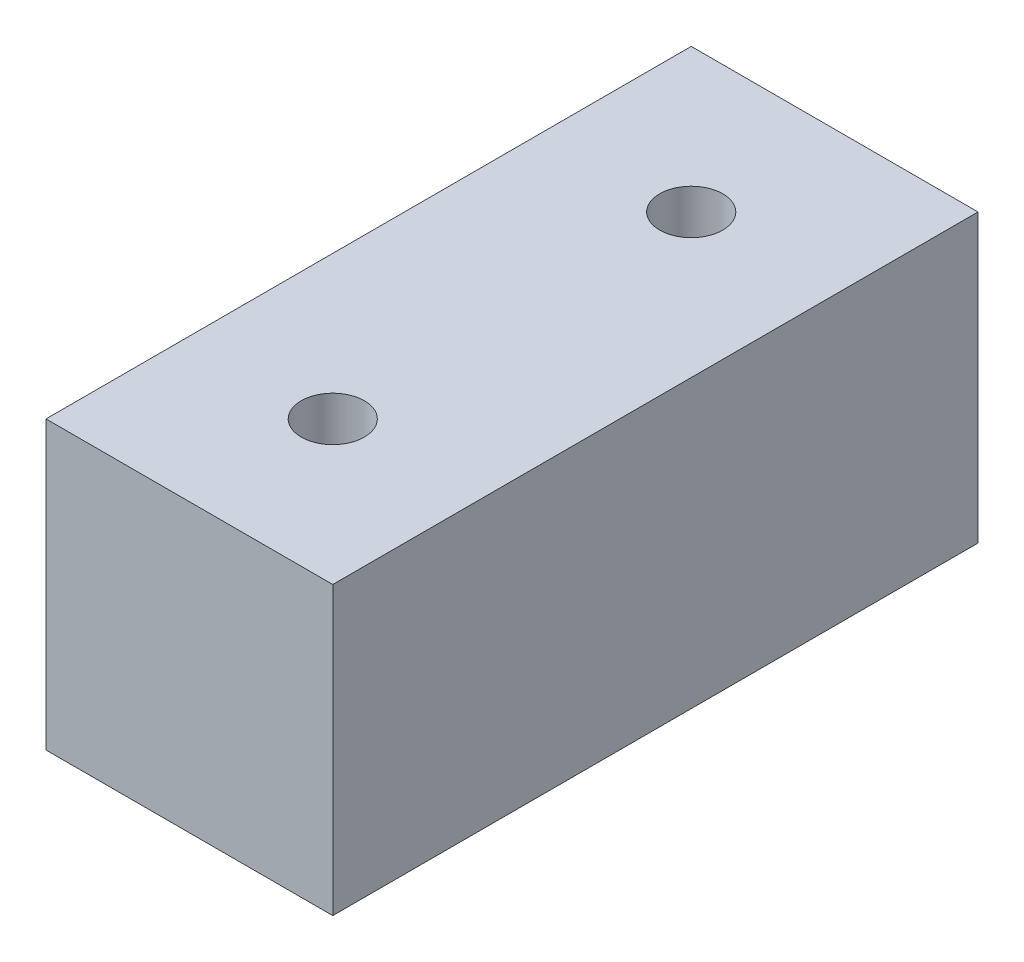
ISO-10303-21;
HEADER;
FILE_DESCRIPTION(('STEP AP214'),'2;1');
FILE_NAME('part.step','',(''),(''),'','','');
FILE_SCHEMA(('AUTOMOTIVE_DESIGN { 1 0 10303 214 1 1 1 1 }'));
ENDSEC;
DATA;
#1=APPLICATION_CONTEXT('core data for automotive mechanical design processes');
#2=APPLICATION_PROTOCOL_DEFINITION('international standard','automotive_design',2000,#1);
#3=PRODUCT_CONTEXT('',#1,'mechanical');
#4=PRODUCT('Part','Part','',(#3));
#5=PRODUCT_RELATED_PRODUCT_CATEGORY('part','',(#4));
#6=PRODUCT_DEFINITION_FORMATION('','',#4);
#7=PRODUCT_DEFINITION_CONTEXT('part definition',#1,'design');
#8=PRODUCT_DEFINITION('design','',#6,#7);
#9=PRODUCT_DEFINITION_SHAPE('','',#8);
#10=(LENGTH_UNIT() NAMED_UNIT(*) SI_UNIT(.MILLI.,.METRE.));
#11=(NAMED_UNIT(*) PLANE_ANGLE_UNIT() SI_UNIT($,.RADIAN.));
#12=(NAMED_UNIT(*) SI_UNIT($,.STERADIAN.) SOLID_ANGLE_UNIT());
#13=UNCERTAINTY_MEASURE_WITH_UNIT(LENGTH_MEASURE(1.E-05),#10,'distance_accuracy_value','');
#14=(GEOMETRIC_REPRESENTATION_CONTEXT(3) GLOBAL_UNCERTAINTY_ASSIGNED_CONTEXT((#13)) GLOBAL_UNIT_ASSIGNED_CONTEXT((#10,
#11,#12)) REPRESENTATION_CONTEXT('',''));
#15=CARTESIAN_POINT('',(0.,0.,0.));
#16=DIRECTION('',(0.,0.,1.));
#17=DIRECTION('',(1.,0.,0.));
#18=AXIS2_PLACEMENT_3D('',#15,#16,#17);
#19=CARTESIAN_POINT('',(10.,10.,45.));
#20=DIRECTION('',(-1.,0.,0.));
#21=DIRECTION('',(0.,-1.,0.));
#22=AXIS2_PLACEMENT_3D('',#19,#20,#21);
#23=PLANE('',#22);
#24=DIRECTION('',(0.,1.,0.));
#25=VECTOR('',#24,1.);
#26=CARTESIAN_POINT('',(10.,10.,0.));
#27=LINE('',#26,#25);
#28=CARTESIAN_POINT('',(10.,-10.,0.));
#29=VERTEX_POINT('',#28);
#30=CARTESIAN_POINT('',(10.,10.,0.));
#31=VERTEX_POINT('',#30);
#32=EDGE_CURVE('E110',#29,#31,#27,.T.);
#33=ORIENTED_EDGE('',*,*,#32,.T.);
#34=DIRECTION('',(0.,0.,-1.));
#35=VECTOR('',#34,1.);
#36=CARTESIAN_POINT('',(10.,10.,45.));
#37=LINE('',#36,#35);
#38=CARTESIAN_POINT('',(10.,10.,45.));
#39=VERTEX_POINT('',#38);
#40=EDGE_CURVE('E11',#39,#31,#37,.T.);
#41=ORIENTED_EDGE('',*,*,#40,.F.);
#42=DIRECTION('',(0.,1.,0.));
#43=VECTOR('',#42,1.);
#44=CARTESIAN_POINT('',(10.,10.,45.));
#45=LINE('',#44,#43);
#46=CARTESIAN_POINT('',(10.,-10.,45.));
#47=VERTEX_POINT('',#46);
#48=EDGE_CURVE('E94',#47,#39,#45,.T.);
#49=ORIENTED_EDGE('',*,*,#48,.F.);
#50=DIRECTION('',(0.,0.,-1.));
#51=VECTOR('',#50,1.);
#52=CARTESIAN_POINT('',(10.,-10.,45.));
#53=LINE('',#52,#51);
#54=EDGE_CURVE('E103',#47,#29,#53,.T.);
#55=ORIENTED_EDGE('',*,*,#54,.T.);
#56=EDGE_LOOP('',(#33,#41,#49,#55));
#57=FACE_BOUND('',#56,.T.);
#58=ADVANCED_FACE('F41',(#57),#23,.F.);
#59=CARTESIAN_POINT('',(-10.,10.,45.));
#60=DIRECTION('',(0.,-1.,0.));
#61=DIRECTION('',(0.,0.,-1.));
#62=AXIS2_PLACEMENT_3D('',#59,#60,#61);
#63=PLANE('',#62);
#64=CARTESIAN_POINT('',(0.,10.,9.99999999999999));
#65=DIRECTION('',(0.,1.,0.));
#66=DIRECTION('',(0.,0.,1.));
#67=AXIS2_PLACEMENT_3D('',#64,#65,#66);
#68=CIRCLE('',#67,2.2);
#69=CARTESIAN_POINT('',(0.,10.,12.2));
#70=VERTEX_POINT('',#69);
#71=EDGE_CURVE('E118',#70,#70,#68,.T.);
#72=ORIENTED_EDGE('',*,*,#71,.F.);
#73=EDGE_LOOP('',(#72));
#74=FACE_BOUND('',#73,.T.);
#75=CARTESIAN_POINT('',(0.,10.,35.));
#76=DIRECTION('',(0.,1.,0.));
#77=DIRECTION('',(0.,0.,1.));
#78=AXIS2_PLACEMENT_3D('',#75,#76,#77);
#79=CIRCLE('',#78,2.2);
#80=CARTESIAN_POINT('',(0.,10.,37.2));
#81=VERTEX_POINT('',#80);
#82=EDGE_CURVE('E122',#81,#81,#79,.T.);
#83=ORIENTED_EDGE('',*,*,#82,.F.);
#84=EDGE_LOOP('',(#83));
#85=FACE_BOUND('',#84,.T.);
#86=DIRECTION('',(-1.,0.,0.));
#87=VECTOR('',#86,1.);
#88=CARTESIAN_POINT('',(-10.,10.,0.));
#89=LINE('',#88,#87);
#90=CARTESIAN_POINT('',(-10.,10.,0.));
#91=VERTEX_POINT('',#90);
#92=EDGE_CURVE('E98',#31,#91,#89,.T.);
#93=ORIENTED_EDGE('',*,*,#92,.T.);
#94=DIRECTION('',(0.,0.,-1.));
#95=VECTOR('',#94,1.);
#96=CARTESIAN_POINT('',(-10.,10.,45.));
#97=LINE('',#96,#95);
#98=CARTESIAN_POINT('',(-10.,10.,45.));
#99=VERTEX_POINT('',#98);
#100=EDGE_CURVE('E49',#99,#91,#97,.T.);
#101=ORIENTED_EDGE('',*,*,#100,.F.);
#102=DIRECTION('',(-1.,0.,0.));
#103=VECTOR('',#102,1.);
#104=CARTESIAN_POINT('',(-10.,10.,45.));
#105=LINE('',#104,#103);
#106=EDGE_CURVE('E90',#39,#99,#105,.T.);
#107=ORIENTED_EDGE('',*,*,#106,.F.);
#108=ORIENTED_EDGE('',*,*,#40,.T.);
#109=EDGE_LOOP('',(#93,#101,#107,#108));
#110=FACE_BOUND('',#109,.T.);
#111=ADVANCED_FACE('F100',(#74,#85,#110),#63,.F.);
#112=CARTESIAN_POINT('',(-10.,10.,45.));
#113=DIRECTION('',(1.,0.,0.));
#114=DIRECTION('',(0.,1.,0.));
#115=AXIS2_PLACEMENT_3D('',#112,#113,#114);
#116=PLANE('',#115);
#117=DIRECTION('',(0.,-1.,0.));
#118=VECTOR('',#117,1.);
#119=CARTESIAN_POINT('',(-10.,10.,0.));
#120=LINE('',#119,#118);
#121=CARTESIAN_POINT('',(-10.,-10.,0.));
#122=VERTEX_POINT('',#121);
#123=EDGE_CURVE('E78',#91,#122,#120,.T.);
#124=ORIENTED_EDGE('',*,*,#123,.T.);
#125=DIRECTION('',(0.,0.,-1.));
#126=VECTOR('',#125,1.);
#127=CARTESIAN_POINT('',(-10.,-10.,45.));
#128=LINE('',#127,#126);
#129=CARTESIAN_POINT('',(-10.,-10.,45.));
#130=VERTEX_POINT('',#129);
#131=EDGE_CURVE('E97',#130,#122,#128,.T.);
#132=ORIENTED_EDGE('',*,*,#131,.F.);
#133=DIRECTION('',(0.,-1.,0.));
#134=VECTOR('',#133,1.);
#135=CARTESIAN_POINT('',(-10.,10.,45.));
#136=LINE('',#135,#134);
#137=EDGE_CURVE('E95',#99,#130,#136,.T.);
#138=ORIENTED_EDGE('',*,*,#137,.F.);
#139=ORIENTED_EDGE('',*,*,#100,.T.);
#140=EDGE_LOOP('',(#124,#132,#138,#139));
#141=FACE_BOUND('',#140,.T.);
#142=ADVANCED_FACE('F101',(#141),#116,.F.);
#143=CARTESIAN_POINT('',(-10.,-10.,45.));
#144=DIRECTION('',(0.,1.,0.));
#145=DIRECTION('',(0.,0.,1.));
#146=AXIS2_PLACEMENT_3D('',#143,#144,#145);
#147=PLANE('',#146);
#148=CARTESIAN_POINT('',(0.,-10.,9.99999999999999));
#149=DIRECTION('',(0.,1.,0.));
#150=DIRECTION('',(0.,0.,1.));
#151=AXIS2_PLACEMENT_3D('',#148,#149,#150);
#152=CIRCLE('',#151,2.2);
#153=CARTESIAN_POINT('',(0.,-10.,12.2));
#154=VERTEX_POINT('',#153);
#155=EDGE_CURVE('E42',#154,#154,#152,.T.);
#156=ORIENTED_EDGE('',*,*,#155,.T.);
#157=EDGE_LOOP('',(#156));
#158=FACE_BOUND('',#157,.T.);
#159=CARTESIAN_POINT('',(0.,-10.,35.));
#160=DIRECTION('',(0.,1.,0.));
#161=DIRECTION('',(0.,0.,1.));
#162=AXIS2_PLACEMENT_3D('',#159,#160,#161);
#163=CIRCLE('',#162,2.2);
#164=CARTESIAN_POINT('',(0.,-10.,37.2));
#165=VERTEX_POINT('',#164);
#166=EDGE_CURVE('E111',#165,#165,#163,.T.);
#167=ORIENTED_EDGE('',*,*,#166,.T.);
#168=EDGE_LOOP('',(#167));
#169=FACE_BOUND('',#168,.T.);
#170=DIRECTION('',(1.,0.,0.));
#171=VECTOR('',#170,1.);
#172=CARTESIAN_POINT('',(-10.,-10.,0.));
#173=LINE('',#172,#171);
#174=EDGE_CURVE('E85',#122,#29,#173,.T.);
#175=ORIENTED_EDGE('',*,*,#174,.T.);
#176=ORIENTED_EDGE('',*,*,#54,.F.);
#177=DIRECTION('',(1.,0.,0.));
#178=VECTOR('',#177,1.);
#179=CARTESIAN_POINT('',(-10.,-10.,45.));
#180=LINE('',#179,#178);
#181=EDGE_CURVE('E56',#130,#47,#180,.T.);
#182=ORIENTED_EDGE('',*,*,#181,.F.);
#183=ORIENTED_EDGE('',*,*,#131,.T.);
#184=EDGE_LOOP('',(#175,#176,#182,#183));
#185=FACE_BOUND('',#184,.T.);
#186=ADVANCED_FACE('F136',(#158,#169,#185),#147,.F.);
#187=CARTESIAN_POINT('',(0.,0.,45.));
#188=DIRECTION('',(0.,0.,1.));
#189=DIRECTION('',(1.,0.,0.));
#190=AXIS2_PLACEMENT_3D('',#187,#188,#189);
#191=PLANE('',#190);
#192=ORIENTED_EDGE('',*,*,#48,.T.);
#193=ORIENTED_EDGE('',*,*,#106,.T.);
#194=ORIENTED_EDGE('',*,*,#137,.T.);
#195=ORIENTED_EDGE('',*,*,#181,.T.);
#196=EDGE_LOOP('',(#192,#193,#194,#195));
#197=FACE_BOUND('',#196,.T.);
#198=ADVANCED_FACE('F89',(#197),#191,.T.);
#199=CARTESIAN_POINT('',(0.,0.,0.));
#200=DIRECTION('',(0.,0.,1.));
#201=DIRECTION('',(1.,0.,0.));
#202=AXIS2_PLACEMENT_3D('',#199,#200,#201);
#203=PLANE('',#202);
#204=ORIENTED_EDGE('',*,*,#32,.F.);
#205=ORIENTED_EDGE('',*,*,#174,.F.);
#206=ORIENTED_EDGE('',*,*,#123,.F.);
#207=ORIENTED_EDGE('',*,*,#92,.F.);
#208=EDGE_LOOP('',(#204,#205,#206,#207));
#209=FACE_BOUND('',#208,.T.);
#210=ADVANCED_FACE('F148',(#209),#203,.F.);
#211=CARTESIAN_POINT('',(0.,-35.,35.));
#212=DIRECTION('',(0.,1.,0.));
#213=DIRECTION('',(0.,0.,1.));
#214=AXIS2_PLACEMENT_3D('',#211,#212,#213);
#215=CYLINDRICAL_SURFACE('',#214,2.2);
#216=CARTESIAN_POINT('',(0.,10.,37.2));
#217=CARTESIAN_POINT('',(0.,9.79166666666667,37.2));
#218=CARTESIAN_POINT('',(0.,9.58333333333333,37.2));
#219=CARTESIAN_POINT('',(0.,9.16666666666667,37.2));
#220=CARTESIAN_POINT('',(0.,8.95833333333333,37.2));
#221=CARTESIAN_POINT('',(0.,8.54166666666667,37.2));
#222=CARTESIAN_POINT('',(0.,8.33333333333333,37.2));
#223=CARTESIAN_POINT('',(0.,7.91666666666667,37.2));
#224=CARTESIAN_POINT('',(0.,7.70833333333333,37.2));
#225=CARTESIAN_POINT('',(0.,7.29166666666667,37.2));
#226=CARTESIAN_POINT('',(0.,7.08333333333333,37.2));
#227=CARTESIAN_POINT('',(0.,6.66666666666667,37.2));
#228=CARTESIAN_POINT('',(0.,6.45833333333333,37.2));
#229=CARTESIAN_POINT('',(0.,6.04166666666667,37.2));
#230=CARTESIAN_POINT('',(0.,5.83333333333333,37.2));
#231=CARTESIAN_POINT('',(0.,5.41666666666666,37.2));
#232=CARTESIAN_POINT('',(0.,5.20833333333333,37.2));
#233=CARTESIAN_POINT('',(0.,4.79166666666666,37.2));
#234=CARTESIAN_POINT('',(0.,4.58333333333333,37.2));
#235=CARTESIAN_POINT('',(0.,4.16666666666666,37.2));
#236=CARTESIAN_POINT('',(0.,3.95833333333333,37.2));
#237=CARTESIAN_POINT('',(0.,3.54166666666666,37.2));
#238=CARTESIAN_POINT('',(0.,3.33333333333333,37.2));
#239=CARTESIAN_POINT('',(0.,2.91666666666666,37.2));
#240=CARTESIAN_POINT('',(0.,2.70833333333333,37.2));
#241=CARTESIAN_POINT('',(0.,2.29166666666666,37.2));
#242=CARTESIAN_POINT('',(0.,2.08333333333333,37.2));
#243=CARTESIAN_POINT('',(0.,1.66666666666666,37.2));
#244=CARTESIAN_POINT('',(0.,1.45833333333333,37.2));
#245=CARTESIAN_POINT('',(0.,1.04166666666666,37.2));
#246=CARTESIAN_POINT('',(0.,0.833333333333327,37.2));
#247=CARTESIAN_POINT('',(0.,0.41666666666666,37.2));
#248=CARTESIAN_POINT('',(0.,0.208333333333327,37.2));
#249=CARTESIAN_POINT('',(0.,-0.20833333333334,37.2));
#250=CARTESIAN_POINT('',(0.,-0.416666666666674,37.2));
#251=CARTESIAN_POINT('',(0.,-0.833333333333341,37.2));
#252=CARTESIAN_POINT('',(0.,-1.04166666666667,37.2));
#253=CARTESIAN_POINT('',(0.,-1.45833333333334,37.2));
#254=CARTESIAN_POINT('',(0.,-1.66666666666668,37.2));
#255=CARTESIAN_POINT('',(0.,-2.08333333333334,37.2));
#256=CARTESIAN_POINT('',(0.,-2.29166666666668,37.2));
#257=CARTESIAN_POINT('',(0.,-2.70833333333334,37.2));
#258=CARTESIAN_POINT('',(0.,-2.91666666666667,37.2));
#259=CARTESIAN_POINT('',(0.,-3.33333333333334,37.2));
#260=CARTESIAN_POINT('',(0.,-3.54166666666667,37.2));
#261=CARTESIAN_POINT('',(0.,-3.95833333333334,37.2));
#262=CARTESIAN_POINT('',(0.,-4.16666666666667,37.2));
#263=CARTESIAN_POINT('',(0.,-4.58333333333333,37.2));
#264=CARTESIAN_POINT('',(0.,-4.79166666666667,37.2));
#265=CARTESIAN_POINT('',(0.,-5.20833333333333,37.2));
#266=CARTESIAN_POINT('',(0.,-5.41666666666667,37.2));
#267=CARTESIAN_POINT('',(0.,-5.83333333333334,37.2));
#268=CARTESIAN_POINT('',(0.,-6.04166666666667,37.2));
#269=CARTESIAN_POINT('',(0.,-6.45833333333334,37.2));
#270=CARTESIAN_POINT('',(0.,-6.66666666666667,37.2));
#271=CARTESIAN_POINT('',(0.,-7.08333333333334,37.2));
#272=CARTESIAN_POINT('',(0.,-7.29166666666667,37.2));
#273=CARTESIAN_POINT('',(0.,-7.70833333333334,37.2));
#274=CARTESIAN_POINT('',(0.,-7.91666666666667,37.2));
#275=CARTESIAN_POINT('',(0.,-8.33333333333334,37.2));
#276=CARTESIAN_POINT('',(0.,-8.54166666666667,37.2));
#277=CARTESIAN_POINT('',(0.,-8.95833333333334,37.2));
#278=CARTESIAN_POINT('',(0.,-9.16666666666667,37.2));
#279=CARTESIAN_POINT('',(0.,-9.58333333333334,37.2));
#280=CARTESIAN_POINT('',(0.,-9.79166666666667,37.2));
#281=CARTESIAN_POINT('',(0.,-10.,37.2));
#282=B_SPLINE_CURVE_WITH_KNOTS('',3,(#216,#217,#218,#219,#220,#221,#222,#223,#224,#225,#226,
#227,#228,#229,#230,#231,#232,#233,#234,#235,#236,#237,#238,#239,#240,#241,#242,#243,#244,#245,
#246,#247,#248,#249,#250,#251,#252,#253,#254,#255,#256,#257,#258,#259,#260,#261,#262,#263,#264,
#265,#266,#267,#268,#269,#270,#271,#272,#273,#274,#275,#276,#277,#278,#279,#280,#281),
.UNSPECIFIED.,.F.,.F.,(4,2,2,2,2,2,2,2,2,2,2,2,2,2,2,2,2,2,2,2,2,2,2,2,2,2,2,2,2,2,2,2,4),(0.,
0.625000000000001,1.25,1.875,2.5,3.125,3.75,4.375,5.,5.62500000000001,6.25000000000001,
6.87500000000001,7.50000000000001,8.12500000000001,8.75000000000001,9.37500000000001,10.,10.625,
11.25,11.875,12.5,13.125,13.75,14.375,15.,15.625,16.25,16.875,17.5,18.125,18.75,19.375,20.),.UNSPECIFIED.);
#283=EDGE_CURVE('BSEAM129',#81,#165,#282,.T.);
#284=ORIENTED_EDGE('',*,*,#82,.T.);
#285=ORIENTED_EDGE('',*,*,#166,.F.);
#286=ORIENTED_EDGE('',*,*,#283,.T.);
#287=ORIENTED_EDGE('',*,*,#283,.F.);
#288=EDGE_LOOP('',(#284,#286,#285,#287));
#289=FACE_BOUND('',#288,.T.);
#290=ADVANCED_FACE('F129',(#289),#215,.F.);
#291=CARTESIAN_POINT('',(0.,-35.,9.99999999999999));
#292=DIRECTION('',(0.,1.,0.));
#293=DIRECTION('',(0.,0.,1.));
#294=AXIS2_PLACEMENT_3D('',#291,#292,#293);
#295=CYLINDRICAL_SURFACE('',#294,2.2);
#296=CARTESIAN_POINT('',(0.,10.,12.2));
#297=CARTESIAN_POINT('',(0.,9.79166666666667,12.2));
#298=CARTESIAN_POINT('',(0.,9.58333333333333,12.2));
#299=CARTESIAN_POINT('',(0.,9.16666666666667,12.2));
#300=CARTESIAN_POINT('',(0.,8.95833333333333,12.2));
#301=CARTESIAN_POINT('',(0.,8.54166666666667,12.2));
#302=CARTESIAN_POINT('',(0.,8.33333333333333,12.2));
#303=CARTESIAN_POINT('',(0.,7.91666666666667,12.2));
#304=CARTESIAN_POINT('',(0.,7.70833333333333,12.2));
#305=CARTESIAN_POINT('',(0.,7.29166666666667,12.2));
#306=CARTESIAN_POINT('',(0.,7.08333333333333,12.2));
#307=CARTESIAN_POINT('',(0.,6.66666666666667,12.2));
#308=CARTESIAN_POINT('',(0.,6.45833333333333,12.2));
#309=CARTESIAN_POINT('',(0.,6.04166666666667,12.2));
#310=CARTESIAN_POINT('',(0.,5.83333333333333,12.2));
#311=CARTESIAN_POINT('',(0.,5.41666666666666,12.2));
#312=CARTESIAN_POINT('',(0.,5.20833333333333,12.2));
#313=CARTESIAN_POINT('',(0.,4.79166666666666,12.2));
#314=CARTESIAN_POINT('',(0.,4.58333333333333,12.2));
#315=CARTESIAN_POINT('',(0.,4.16666666666666,12.2));
#316=CARTESIAN_POINT('',(0.,3.95833333333333,12.2));
#317=CARTESIAN_POINT('',(0.,3.54166666666666,12.2));
#318=CARTESIAN_POINT('',(0.,3.33333333333333,12.2));
#319=CARTESIAN_POINT('',(0.,2.91666666666666,12.2));
#320=CARTESIAN_POINT('',(0.,2.70833333333333,12.2));
#321=CARTESIAN_POINT('',(0.,2.29166666666666,12.2));
#322=CARTESIAN_POINT('',(0.,2.08333333333333,12.2));
#323=CARTESIAN_POINT('',(0.,1.66666666666666,12.2));
#324=CARTESIAN_POINT('',(0.,1.45833333333333,12.2));
#325=CARTESIAN_POINT('',(0.,1.04166666666666,12.2));
#326=CARTESIAN_POINT('',(0.,0.833333333333327,12.2));
#327=CARTESIAN_POINT('',(0.,0.41666666666666,12.2));
#328=CARTESIAN_POINT('',(0.,0.208333333333327,12.2));
#329=CARTESIAN_POINT('',(0.,-0.20833333333334,12.2));
#330=CARTESIAN_POINT('',(0.,-0.416666666666674,12.2));
#331=CARTESIAN_POINT('',(0.,-0.833333333333341,12.2));
#332=CARTESIAN_POINT('',(0.,-1.04166666666667,12.2));
#333=CARTESIAN_POINT('',(0.,-1.45833333333334,12.2));
#334=CARTESIAN_POINT('',(0.,-1.66666666666668,12.2));
#335=CARTESIAN_POINT('',(0.,-2.08333333333334,12.2));
#336=CARTESIAN_POINT('',(0.,-2.29166666666668,12.2));
#337=CARTESIAN_POINT('',(0.,-2.70833333333334,12.2));
#338=CARTESIAN_POINT('',(0.,-2.91666666666667,12.2));
#339=CARTESIAN_POINT('',(0.,-3.33333333333334,12.2));
#340=CARTESIAN_POINT('',(0.,-3.54166666666667,12.2));
#341=CARTESIAN_POINT('',(0.,-3.95833333333334,12.2));
#342=CARTESIAN_POINT('',(0.,-4.16666666666667,12.2));
#343=CARTESIAN_POINT('',(0.,-4.58333333333333,12.2));
#344=CARTESIAN_POINT('',(0.,-4.79166666666667,12.2));
#345=CARTESIAN_POINT('',(0.,-5.20833333333333,12.2));
#346=CARTESIAN_POINT('',(0.,-5.41666666666667,12.2));
#347=CARTESIAN_POINT('',(0.,-5.83333333333334,12.2));
#348=CARTESIAN_POINT('',(0.,-6.04166666666667,12.2));
#349=CARTESIAN_POINT('',(0.,-6.45833333333334,12.2));
#350=CARTESIAN_POINT('',(0.,-6.66666666666667,12.2));
#351=CARTESIAN_POINT('',(0.,-7.08333333333334,12.2));
#352=CARTESIAN_POINT('',(0.,-7.29166666666667,12.2));
#353=CARTESIAN_POINT('',(0.,-7.70833333333334,12.2));
#354=CARTESIAN_POINT('',(0.,-7.91666666666667,12.2));
#355=CARTESIAN_POINT('',(0.,-8.33333333333334,12.2));
#356=CARTESIAN_POINT('',(0.,-8.54166666666667,12.2));
#357=CARTESIAN_POINT('',(0.,-8.95833333333334,12.2));
#358=CARTESIAN_POINT('',(0.,-9.16666666666667,12.2));
#359=CARTESIAN_POINT('',(0.,-9.58333333333334,12.2));
#360=CARTESIAN_POINT('',(0.,-9.79166666666667,12.2));
#361=CARTESIAN_POINT('',(0.,-10.,12.2));
#362=B_SPLINE_CURVE_WITH_KNOTS('',3,(#296,#297,#298,#299,#300,#301,#302,#303,#304,#305,#306,
#307,#308,#309,#310,#311,#312,#313,#314,#315,#316,#317,#318,#319,#320,#321,#322,#323,#324,#325,
#326,#327,#328,#329,#330,#331,#332,#333,#334,#335,#336,#337,#338,#339,#340,#341,#342,#343,#344,
#345,#346,#347,#348,#349,#350,#351,#352,#353,#354,#355,#356,#357,#358,#359,#360,#361),
.UNSPECIFIED.,.F.,.F.,(4,2,2,2,2,2,2,2,2,2,2,2,2,2,2,2,2,2,2,2,2,2,2,2,2,2,2,2,2,2,2,2,4),(0.,
0.625000000000001,1.25,1.875,2.5,3.125,3.75,4.375,5.,5.62500000000001,6.25000000000001,
6.87500000000001,7.50000000000001,8.12500000000001,8.75000000000001,9.37500000000001,10.,10.625,
11.25,11.875,12.5,13.125,13.75,14.375,15.,15.625,16.25,16.875,17.5,18.125,18.75,19.375,20.),.UNSPECIFIED.);
#363=EDGE_CURVE('BSEAM153',#70,#154,#362,.T.);
#364=ORIENTED_EDGE('',*,*,#71,.T.);
#365=ORIENTED_EDGE('',*,*,#155,.F.);
#366=ORIENTED_EDGE('',*,*,#363,.T.);
#367=ORIENTED_EDGE('',*,*,#363,.F.);
#368=EDGE_LOOP('',(#364,#366,#365,#367));
#369=FACE_BOUND('',#368,.T.);
#370=ADVANCED_FACE('F153',(#369),#295,.F.);
#371=CLOSED_SHELL('',(#58,#111,#142,#186,#198,#210,#290,#370));
#372=MANIFOLD_SOLID_BREP('B2',#371);
#373=ADVANCED_BREP_SHAPE_REPRESENTATION('',(#18,#372),#14);
#374=SHAPE_DEFINITION_REPRESENTATION(#9,#373);
ENDSEC;
END-ISO-10303-21;
